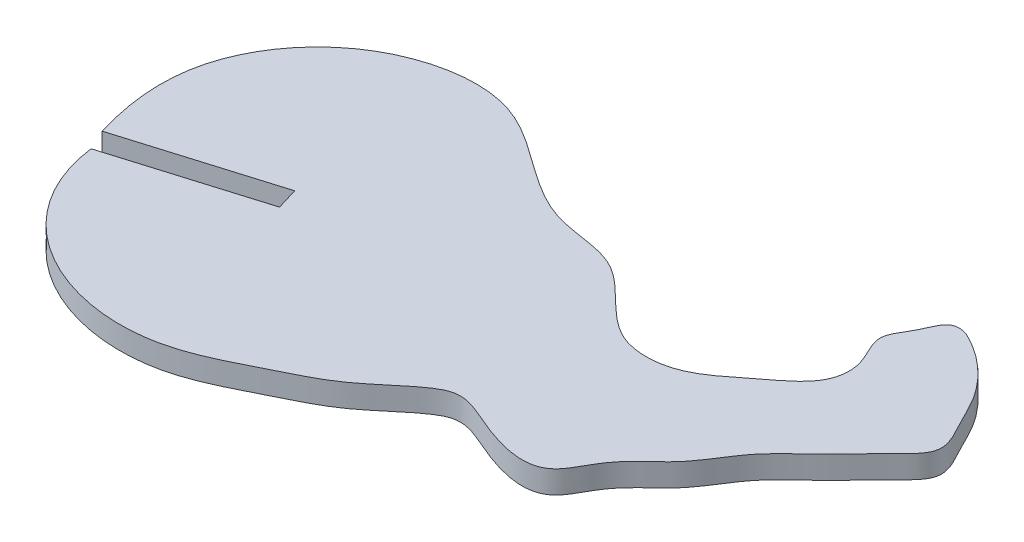
ISO-10303-21;
HEADER;
FILE_DESCRIPTION(('STEP AP214'),'2;1');
FILE_NAME('part.step','',(''),(''),'','','');
FILE_SCHEMA(('AUTOMOTIVE_DESIGN { 1 0 10303 214 1 1 1 1 }'));
ENDSEC;
DATA;
#1=APPLICATION_CONTEXT('core data for automotive mechanical design processes');
#2=APPLICATION_PROTOCOL_DEFINITION('international standard','automotive_design',2000,#1);
#3=PRODUCT_CONTEXT('',#1,'mechanical');
#4=PRODUCT('Part','Part','',(#3));
#5=PRODUCT_RELATED_PRODUCT_CATEGORY('part','',(#4));
#6=PRODUCT_DEFINITION_FORMATION('','',#4);
#7=PRODUCT_DEFINITION_CONTEXT('part definition',#1,'design');
#8=PRODUCT_DEFINITION('design','',#6,#7);
#9=PRODUCT_DEFINITION_SHAPE('','',#8);
#10=(LENGTH_UNIT() NAMED_UNIT(*) SI_UNIT(.MILLI.,.METRE.));
#11=(NAMED_UNIT(*) PLANE_ANGLE_UNIT() SI_UNIT($,.RADIAN.));
#12=(NAMED_UNIT(*) SI_UNIT($,.STERADIAN.) SOLID_ANGLE_UNIT());
#13=UNCERTAINTY_MEASURE_WITH_UNIT(LENGTH_MEASURE(1.E-05),#10,'distance_accuracy_value','');
#14=(GEOMETRIC_REPRESENTATION_CONTEXT(3) GLOBAL_UNCERTAINTY_ASSIGNED_CONTEXT((#13)) GLOBAL_UNIT_ASSIGNED_CONTEXT((#10,
#11,#12)) REPRESENTATION_CONTEXT('',''));
#15=CARTESIAN_POINT('',(0.,0.,0.));
#16=DIRECTION('',(0.,0.,1.));
#17=DIRECTION('',(1.,0.,0.));
#18=AXIS2_PLACEMENT_3D('',#15,#16,#17);
#19=CARTESIAN_POINT('',(354.758784133582,4.,-92.95550987386));
#20=CARTESIAN_POINT('',(351.264618646972,4.,-94.2312441241664));
#21=CARTESIAN_POINT('',(350.6234009771,4.,-89.7752227979004));
#22=CARTESIAN_POINT('',(346.461727608902,4.,-84.7135727155003));
#23=CARTESIAN_POINT('',(350.205187422478,4.,-79.9595934800238));
#24=CARTESIAN_POINT('',(350.13611193606,4.,-72.7632720854894));
#25=CARTESIAN_POINT('',(342.566986953231,4.,-67.6241349733789));
#26=CARTESIAN_POINT('',(335.516611302926,4.,-61.2581891625216));
#27=CARTESIAN_POINT('',(322.158981940663,4.,-60.9659955870512));
#28=CARTESIAN_POINT('',(315.198127233669,4.,-73.9131451432485));
#29=CARTESIAN_POINT('',(296.070557928743,4.,-73.72687518143));
#30=CARTESIAN_POINT('',(282.361557352826,4.,-91.2690347490787));
#31=CARTESIAN_POINT('',(256.776729947387,4.,-85.8006787411104));
#32=CARTESIAN_POINT('',(244.063484396974,4.,-67.471230450036));
#33=CARTESIAN_POINT('',(245.876786143825,4.,-54.0588647443665));
#34=CARTESIAN_POINT('',(247.741835851831,4.,-47.874869006339));
#35=B_SPLINE_CURVE_WITH_KNOTS('',3,(#19,#20,#21,#22,#23,#24,#25,#26,#27,#28,#29,#30,#31,#32,#33,
#34),.UNSPECIFIED.,.F.,.F.,(4,1,1,1,1,1,1,1,1,1,1,1,1,4),(0.,0.0429628303076165,
0.0708363611587319,0.107604323711911,0.135122077439241,0.193651049060321,0.257760145423031,
0.30807316298899,0.411830749727002,0.478239550074438,0.630858656359296,0.762731242713335,
0.887118401233988,1.),.UNSPECIFIED.);
#36=DIRECTION('',(0.,-1.,0.));
#37=VECTOR('',#36,1.);
#38=SURFACE_OF_LINEAR_EXTRUSION('',#35,#37);
#39=CARTESIAN_POINT('',(354.758784133582,0.,-92.95550987386));
#40=CARTESIAN_POINT('',(351.264618646972,0.,-94.2312441241664));
#41=CARTESIAN_POINT('',(350.6234009771,0.,-89.7752227979004));
#42=CARTESIAN_POINT('',(346.461727608902,0.,-84.7135727155003));
#43=CARTESIAN_POINT('',(350.205187422478,0.,-79.9595934800238));
#44=CARTESIAN_POINT('',(350.13611193606,0.,-72.7632720854894));
#45=CARTESIAN_POINT('',(342.566986953231,0.,-67.6241349733789));
#46=CARTESIAN_POINT('',(335.516611302926,0.,-61.2581891625216));
#47=CARTESIAN_POINT('',(322.158981940663,0.,-60.9659955870512));
#48=CARTESIAN_POINT('',(315.198127233669,0.,-73.9131451432485));
#49=CARTESIAN_POINT('',(296.070557928743,0.,-73.72687518143));
#50=CARTESIAN_POINT('',(282.361557352826,0.,-91.2690347490787));
#51=CARTESIAN_POINT('',(256.776729947387,0.,-85.8006787411104));
#52=CARTESIAN_POINT('',(244.063484396974,0.,-67.471230450036));
#53=CARTESIAN_POINT('',(245.876786143825,0.,-54.0588647443665));
#54=CARTESIAN_POINT('',(247.741835851831,0.,-47.874869006339));
#55=B_SPLINE_CURVE_WITH_KNOTS('',3,(#39,#40,#41,#42,#43,#44,#45,#46,#47,#48,#49,#50,#51,#52,#53,
#54),.UNSPECIFIED.,.F.,.F.,(4,1,1,1,1,1,1,1,1,1,1,1,1,4),(0.,0.0429628303076165,
0.0708363611587319,0.107604323711911,0.135122077439241,0.193651049060321,0.257760145423031,
0.30807316298899,0.411830749727002,0.478239550074438,0.630858656359296,0.762731242713335,
0.887118401233988,1.),.UNSPECIFIED.);
#56=CARTESIAN_POINT('',(354.758784133582,0.,-92.95550987386));
#57=VERTEX_POINT('',#56);
#58=CARTESIAN_POINT('',(247.741835851831,0.,-47.874869006339));
#59=VERTEX_POINT('',#58);
#60=EDGE_CURVE('E122',#57,#59,#55,.T.);
#61=ORIENTED_EDGE('',*,*,#60,.T.);
#62=DIRECTION('',(0.,-1.,0.));
#63=VECTOR('',#62,1.);
#64=CARTESIAN_POINT('',(247.741835851831,4.,-47.874869006339));
#65=LINE('',#64,#63);
#66=CARTESIAN_POINT('',(247.741835851831,4.,-47.874869006339));
#67=VERTEX_POINT('',#66);
#68=EDGE_CURVE('E11',#67,#59,#65,.T.);
#69=ORIENTED_EDGE('',*,*,#68,.F.);
#70=CARTESIAN_POINT('',(354.758784133582,4.,-92.95550987386));
#71=VERTEX_POINT('',#70);
#72=EDGE_CURVE('E161',#71,#67,#35,.T.);
#73=ORIENTED_EDGE('',*,*,#72,.F.);
#74=DIRECTION('',(0.,-1.,0.));
#75=VECTOR('',#74,1.);
#76=CARTESIAN_POINT('',(354.758784133582,4.,-92.95550987386));
#77=LINE('',#76,#75);
#78=EDGE_CURVE('E115',#71,#57,#77,.T.);
#79=ORIENTED_EDGE('',*,*,#78,.T.);
#80=EDGE_LOOP('',(#61,#69,#73,#79));
#81=FACE_BOUND('',#80,.T.);
#82=ADVANCED_FACE('F39',(#81),#38,.F.);
#83=CARTESIAN_POINT('',(247.741835851831,4.,-47.874869006339));
#84=DIRECTION('',(-0.28874677952466,0.,-0.957405503072829));
#85=DIRECTION('',(-0.957405503072829,0.,0.288746779524661));
#86=AXIS2_PLACEMENT_3D('',#83,#84,#85);
#87=PLANE('',#86);
#88=DIRECTION('',(0.957405503072829,0.,-0.288746779524661));
#89=VECTOR('',#88,1.);
#90=CARTESIAN_POINT('',(247.741835851831,0.,-47.874869006339));
#91=LINE('',#90,#89);
#92=CARTESIAN_POINT('',(273.786081967755,0.,-55.7296308256352));
#93=VERTEX_POINT('',#92);
#94=EDGE_CURVE('E145',#59,#93,#91,.T.);
#95=ORIENTED_EDGE('',*,*,#94,.T.);
#96=DIRECTION('',(0.,-1.,0.));
#97=VECTOR('',#96,1.);
#98=CARTESIAN_POINT('',(273.786081967755,4.,-55.7296308256352));
#99=LINE('',#98,#97);
#100=CARTESIAN_POINT('',(273.786081967755,4.,-55.7296308256352));
#101=VERTEX_POINT('',#100);
#102=EDGE_CURVE('E49',#101,#93,#99,.T.);
#103=ORIENTED_EDGE('',*,*,#102,.F.);
#104=DIRECTION('',(0.957405503072829,0.,-0.288746779524661));
#105=VECTOR('',#104,1.);
#106=CARTESIAN_POINT('',(247.741835851831,4.,-47.874869006339));
#107=LINE('',#106,#105);
#108=EDGE_CURVE('E91',#67,#101,#107,.T.);
#109=ORIENTED_EDGE('',*,*,#108,.F.);
#110=ORIENTED_EDGE('',*,*,#68,.T.);
#111=EDGE_LOOP('',(#95,#103,#109,#110));
#112=FACE_BOUND('',#111,.T.);
#113=ADVANCED_FACE('F139',(#112),#87,.F.);
#114=CARTESIAN_POINT('',(273.786081967755,4.,-55.7296308256352));
#115=DIRECTION('',(0.957405503072829,0.,-0.28874677952466));
#116=DIRECTION('',(-0.28874677952466,0.,-0.957405503072829));
#117=AXIS2_PLACEMENT_3D('',#114,#115,#116);
#118=PLANE('',#117);
#119=DIRECTION('',(0.28874677952466,0.,0.957405503072829));
#120=VECTOR('',#119,1.);
#121=CARTESIAN_POINT('',(273.786081967755,0.,-55.7296308256352));
#122=LINE('',#121,#120);
#123=CARTESIAN_POINT('',(274.941069085853,0.,-51.9000088133439));
#124=VERTEX_POINT('',#123);
#125=EDGE_CURVE('E107',#93,#124,#122,.T.);
#126=ORIENTED_EDGE('',*,*,#125,.T.);
#127=DIRECTION('',(0.,-1.,0.));
#128=VECTOR('',#127,1.);
#129=CARTESIAN_POINT('',(274.941069085853,4.,-51.9000088133439));
#130=LINE('',#129,#128);
#131=CARTESIAN_POINT('',(274.941069085853,4.,-51.9000088133439));
#132=VERTEX_POINT('',#131);
#133=EDGE_CURVE('E104',#132,#124,#130,.T.);
#134=ORIENTED_EDGE('',*,*,#133,.F.);
#135=DIRECTION('',(0.28874677952466,0.,0.957405503072829));
#136=VECTOR('',#135,1.);
#137=CARTESIAN_POINT('',(273.786081967755,4.,-55.7296308256352));
#138=LINE('',#137,#136);
#139=EDGE_CURVE('E95',#101,#132,#138,.T.);
#140=ORIENTED_EDGE('',*,*,#139,.F.);
#141=ORIENTED_EDGE('',*,*,#102,.T.);
#142=EDGE_LOOP('',(#126,#134,#140,#141));
#143=FACE_BOUND('',#142,.T.);
#144=ADVANCED_FACE('F105',(#143),#118,.F.);
#145=CARTESIAN_POINT('',(274.941069085853,4.,-51.9000088133439));
#146=DIRECTION('',(0.288746779524661,0.,0.957405503072829));
#147=DIRECTION('',(0.957405503072829,0.,-0.288746779524661));
#148=AXIS2_PLACEMENT_3D('',#145,#146,#147);
#149=PLANE('',#148);
#150=DIRECTION('',(-0.957405503072829,0.,0.288746779524661));
#151=VECTOR('',#150,1.);
#152=CARTESIAN_POINT('',(274.941069085853,0.,-51.9000088133439));
#153=LINE('',#152,#151);
#154=CARTESIAN_POINT('',(249.445655618744,0.,-44.2107710685745));
#155=VERTEX_POINT('',#154);
#156=EDGE_CURVE('E77',#124,#155,#153,.T.);
#157=ORIENTED_EDGE('',*,*,#156,.T.);
#158=DIRECTION('',(0.,-1.,0.));
#159=VECTOR('',#158,1.);
#160=CARTESIAN_POINT('',(249.445655618744,4.,-44.2107710685745));
#161=LINE('',#160,#159);
#162=CARTESIAN_POINT('',(249.445655618744,4.,-44.2107710685745));
#163=VERTEX_POINT('',#162);
#164=EDGE_CURVE('E109',#163,#155,#161,.T.);
#165=ORIENTED_EDGE('',*,*,#164,.F.);
#166=DIRECTION('',(-0.957405503072829,0.,0.288746779524661));
#167=VECTOR('',#166,1.);
#168=CARTESIAN_POINT('',(274.941069085853,4.,-51.9000088133439));
#169=LINE('',#168,#167);
#170=EDGE_CURVE('E99',#132,#163,#169,.T.);
#171=ORIENTED_EDGE('',*,*,#170,.F.);
#172=ORIENTED_EDGE('',*,*,#133,.T.);
#173=EDGE_LOOP('',(#157,#165,#171,#172));
#174=FACE_BOUND('',#173,.T.);
#175=ADVANCED_FACE('F111',(#174),#149,.F.);
#176=CARTESIAN_POINT('',(249.445655618744,4.,-44.2107710685745));
#177=CARTESIAN_POINT('',(251.932813616643,4.,-25.6037320392683));
#178=CARTESIAN_POINT('',(276.599097951724,4.,-14.4862637778171));
#179=CARTESIAN_POINT('',(297.456861122825,4.,-25.69554713823));
#180=CARTESIAN_POINT('',(307.542077600605,4.,-30.4442882426017));
#181=CARTESIAN_POINT('',(313.075148165206,4.,-35.872262432665));
#182=CARTESIAN_POINT('',(319.352329821259,4.,-40.0439624235279));
#183=CARTESIAN_POINT('',(327.166765998452,4.,-36.220707193897));
#184=CARTESIAN_POINT('',(338.466727575101,4.,-32.49779480852));
#185=CARTESIAN_POINT('',(342.527875726647,4.,-43.0048412381069));
#186=CARTESIAN_POINT('',(349.500951456356,4.,-47.8023092517663));
#187=CARTESIAN_POINT('',(353.818613110751,4.,-56.3474426194779));
#188=CARTESIAN_POINT('',(360.782605143207,4.,-62.0752251936789));
#189=CARTESIAN_POINT('',(365.589270963059,4.,-67.6634023517634));
#190=CARTESIAN_POINT('',(371.305704514947,4.,-72.7293828501092));
#191=CARTESIAN_POINT('',(367.730208942136,4.,-78.6687157661039));
#192=CARTESIAN_POINT('',(364.347560566669,4.,-86.2280612542855));
#193=CARTESIAN_POINT('',(358.916690971228,4.,-91.021761105205));
#194=CARTESIAN_POINT('',(354.758784133582,4.,-92.95550987386));
#195=B_SPLINE_CURVE_WITH_KNOTS('',3,(#176,#177,#178,#179,#180,#181,#182,#183,#184,#185,#186,
#187,#188,#189,#190,#191,#192,#193,#194),.UNSPECIFIED.,.F.,.F.,(4,1,1,1,1,1,1,1,1,1,1,1,1,1,1,1,
4),(0.,0.26272795153985,0.338884413752933,0.392501356195428,0.447045216392114,0.471183226372972,
0.50976040800642,0.585289537031582,0.622559702352668,0.676303525207403,0.72535862847917,
0.779001346802924,0.823359341289712,0.855393326320502,0.888882976061049,0.921773139193979,1.),.UNSPECIFIED.);
#196=DIRECTION('',(0.,-1.,0.));
#197=VECTOR('',#196,1.);
#198=SURFACE_OF_LINEAR_EXTRUSION('',#195,#197);
#199=CARTESIAN_POINT('',(249.445655618744,0.,-44.2107710685745));
#200=CARTESIAN_POINT('',(251.932813616643,0.,-25.6037320392683));
#201=CARTESIAN_POINT('',(276.599097951724,0.,-14.4862637778171));
#202=CARTESIAN_POINT('',(297.456861122825,0.,-25.69554713823));
#203=CARTESIAN_POINT('',(307.542077600605,0.,-30.4442882426017));
#204=CARTESIAN_POINT('',(313.075148165206,0.,-35.872262432665));
#205=CARTESIAN_POINT('',(319.352329821259,0.,-40.0439624235279));
#206=CARTESIAN_POINT('',(327.166765998452,0.,-36.220707193897));
#207=CARTESIAN_POINT('',(338.466727575101,0.,-32.49779480852));
#208=CARTESIAN_POINT('',(342.527875726647,0.,-43.0048412381069));
#209=CARTESIAN_POINT('',(349.500951456356,0.,-47.8023092517663));
#210=CARTESIAN_POINT('',(353.818613110751,0.,-56.3474426194779));
#211=CARTESIAN_POINT('',(360.782605143207,0.,-62.0752251936789));
#212=CARTESIAN_POINT('',(365.589270963059,0.,-67.6634023517634));
#213=CARTESIAN_POINT('',(371.305704514947,0.,-72.7293828501092));
#214=CARTESIAN_POINT('',(367.730208942136,0.,-78.6687157661039));
#215=CARTESIAN_POINT('',(364.347560566669,0.,-86.2280612542855));
#216=CARTESIAN_POINT('',(358.916690971228,0.,-91.021761105205));
#217=CARTESIAN_POINT('',(354.758784133582,0.,-92.95550987386));
#218=B_SPLINE_CURVE_WITH_KNOTS('',3,(#199,#200,#201,#202,#203,#204,#205,#206,#207,#208,#209,
#210,#211,#212,#213,#214,#215,#216,#217),.UNSPECIFIED.,.F.,.F.,(4,1,1,1,1,1,1,1,1,1,1,1,1,1,1,1,
4),(0.,0.26272795153985,0.338884413752933,0.392501356195428,0.447045216392114,0.471183226372972,
0.50976040800642,0.585289537031582,0.622559702352668,0.676303525207403,0.72535862847917,
0.779001346802924,0.823359341289712,0.855393326320502,0.888882976061049,0.921773139193979,1.),.UNSPECIFIED.);
#219=EDGE_CURVE('E83',#155,#57,#218,.T.);
#220=ORIENTED_EDGE('',*,*,#219,.T.);
#221=ORIENTED_EDGE('',*,*,#78,.F.);
#222=EDGE_CURVE('E57',#163,#71,#195,.T.);
#223=ORIENTED_EDGE('',*,*,#222,.F.);
#224=ORIENTED_EDGE('',*,*,#164,.T.);
#225=EDGE_LOOP('',(#220,#221,#223,#224));
#226=FACE_BOUND('',#225,.T.);
#227=ADVANCED_FACE('F130',(#226),#198,.F.);
#228=CARTESIAN_POINT('',(298.236047079153,4.,-76.0554268592892));
#229=DIRECTION('',(0.,-1.,0.));
#230=DIRECTION('',(0.,0.,-1.));
#231=AXIS2_PLACEMENT_3D('',#228,#229,#230);
#232=PLANE('',#231);
#233=ORIENTED_EDGE('',*,*,#72,.T.);
#234=ORIENTED_EDGE('',*,*,#108,.T.);
#235=ORIENTED_EDGE('',*,*,#139,.T.);
#236=ORIENTED_EDGE('',*,*,#170,.T.);
#237=ORIENTED_EDGE('',*,*,#222,.T.);
#238=EDGE_LOOP('',(#233,#234,#235,#236,#237));
#239=FACE_BOUND('',#238,.T.);
#240=ADVANCED_FACE('F97',(#239),#232,.F.);
#241=CARTESIAN_POINT('',(298.236047079153,0.,-76.0554268592892));
#242=DIRECTION('',(0.,-1.,0.));
#243=DIRECTION('',(0.,0.,-1.));
#244=AXIS2_PLACEMENT_3D('',#241,#242,#243);
#245=PLANE('',#244);
#246=ORIENTED_EDGE('',*,*,#60,.F.);
#247=ORIENTED_EDGE('',*,*,#219,.F.);
#248=ORIENTED_EDGE('',*,*,#156,.F.);
#249=ORIENTED_EDGE('',*,*,#125,.F.);
#250=ORIENTED_EDGE('',*,*,#94,.F.);
#251=EDGE_LOOP('',(#246,#247,#248,#249,#250));
#252=FACE_BOUND('',#251,.T.);
#253=ADVANCED_FACE('F134',(#252),#245,.T.);
#254=CLOSED_SHELL('',(#82,#113,#144,#175,#227,#240,#253));
#255=MANIFOLD_SOLID_BREP('B2',#254);
#256=ADVANCED_BREP_SHAPE_REPRESENTATION('',(#18,#255),#14);
#257=SHAPE_DEFINITION_REPRESENTATION(#9,#256);
ENDSEC;
END-ISO-10303-21;
